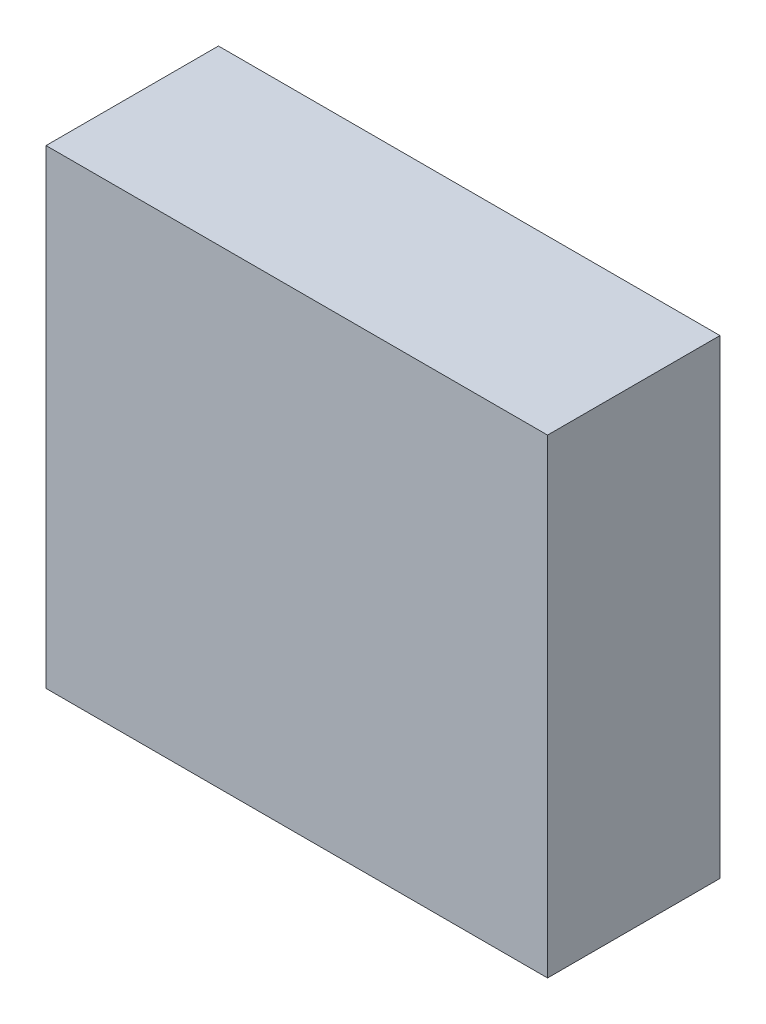
ISO-10303-21;
HEADER;
FILE_DESCRIPTION(('STEP AP214'),'2;1');
FILE_NAME('part.step','',(''),(''),'','','');
FILE_SCHEMA(('AUTOMOTIVE_DESIGN { 1 0 10303 214 1 1 1 1 }'));
ENDSEC;
DATA;
#1=APPLICATION_CONTEXT('core data for automotive mechanical design processes');
#2=APPLICATION_PROTOCOL_DEFINITION('international standard','automotive_design',2000,#1);
#3=PRODUCT_CONTEXT('',#1,'mechanical');
#4=PRODUCT('Part','Part','',(#3));
#5=PRODUCT_RELATED_PRODUCT_CATEGORY('part','',(#4));
#6=PRODUCT_DEFINITION_FORMATION('','',#4);
#7=PRODUCT_DEFINITION_CONTEXT('part definition',#1,'design');
#8=PRODUCT_DEFINITION('design','',#6,#7);
#9=PRODUCT_DEFINITION_SHAPE('','',#8);
#10=(LENGTH_UNIT() NAMED_UNIT(*) SI_UNIT(.MILLI.,.METRE.));
#11=(NAMED_UNIT(*) PLANE_ANGLE_UNIT() SI_UNIT($,.RADIAN.));
#12=(NAMED_UNIT(*) SI_UNIT($,.STERADIAN.) SOLID_ANGLE_UNIT());
#13=UNCERTAINTY_MEASURE_WITH_UNIT(LENGTH_MEASURE(1.E-05),#10,'distance_accuracy_value','');
#14=(GEOMETRIC_REPRESENTATION_CONTEXT(3) GLOBAL_UNCERTAINTY_ASSIGNED_CONTEXT((#13)) GLOBAL_UNIT_ASSIGNED_CONTEXT((#10,
#11,#12)) REPRESENTATION_CONTEXT('',''));
#15=CARTESIAN_POINT('',(0.,0.,0.));
#16=DIRECTION('',(0.,0.,1.));
#17=DIRECTION('',(1.,0.,0.));
#18=AXIS2_PLACEMENT_3D('',#15,#16,#17);
#19=CARTESIAN_POINT('',(42.,-174.,242.5));
#20=DIRECTION('',(0.,0.,1.));
#21=DIRECTION('',(1.,0.,0.));
#22=AXIS2_PLACEMENT_3D('',#19,#20,#21);
#23=PLANE('',#22);
#24=DIRECTION('',(0.,1.,0.));
#25=VECTOR('',#24,1.);
#26=CARTESIAN_POINT('',(42.,-174.,242.5));
#27=LINE('',#26,#25);
#28=CARTESIAN_POINT('',(42.,-174.,242.5));
#29=VERTEX_POINT('',#28);
#30=CARTESIAN_POINT('',(42.,-114.,242.5));
#31=VERTEX_POINT('',#30);
#32=EDGE_CURVE('E18',#29,#31,#27,.T.);
#33=ORIENTED_EDGE('',*,*,#32,.F.);
#34=DIRECTION('',(1.,0.,0.));
#35=VECTOR('',#34,1.);
#36=CARTESIAN_POINT('',(42.,-174.,242.5));
#37=LINE('',#36,#35);
#38=CARTESIAN_POINT('',(106.,-174.,242.5));
#39=VERTEX_POINT('',#38);
#40=EDGE_CURVE('E148',#29,#39,#37,.T.);
#41=ORIENTED_EDGE('',*,*,#40,.T.);
#42=DIRECTION('',(0.,1.,0.));
#43=VECTOR('',#42,1.);
#44=CARTESIAN_POINT('',(106.,-174.,242.5));
#45=LINE('',#44,#43);
#46=CARTESIAN_POINT('',(106.,-114.,242.5));
#47=VERTEX_POINT('',#46);
#48=EDGE_CURVE('E67',#39,#47,#45,.T.);
#49=ORIENTED_EDGE('',*,*,#48,.T.);
#50=DIRECTION('',(1.,0.,0.));
#51=VECTOR('',#50,1.);
#52=CARTESIAN_POINT('',(42.,-114.,242.5));
#53=LINE('',#52,#51);
#54=EDGE_CURVE('E9',#31,#47,#53,.T.);
#55=ORIENTED_EDGE('',*,*,#54,.F.);
#56=EDGE_LOOP('',(#33,#41,#49,#55));
#57=FACE_BOUND('',#56,.T.);
#58=ADVANCED_FACE('F14',(#57),#23,.T.);
#59=CARTESIAN_POINT('',(42.,-174.,220.5));
#60=DIRECTION('',(0.,0.,1.));
#61=DIRECTION('',(1.,0.,0.));
#62=AXIS2_PLACEMENT_3D('',#59,#60,#61);
#63=PLANE('',#62);
#64=DIRECTION('',(1.,0.,0.));
#65=VECTOR('',#64,1.);
#66=CARTESIAN_POINT('',(42.,-114.,220.5));
#67=LINE('',#66,#65);
#68=CARTESIAN_POINT('',(42.,-114.,220.5));
#69=VERTEX_POINT('',#68);
#70=CARTESIAN_POINT('',(106.,-114.,220.5));
#71=VERTEX_POINT('',#70);
#72=EDGE_CURVE('E25',#69,#71,#67,.T.);
#73=ORIENTED_EDGE('',*,*,#72,.T.);
#74=DIRECTION('',(0.,1.,0.));
#75=VECTOR('',#74,1.);
#76=CARTESIAN_POINT('',(106.,-174.,220.5));
#77=LINE('',#76,#75);
#78=CARTESIAN_POINT('',(106.,-174.,220.5));
#79=VERTEX_POINT('',#78);
#80=EDGE_CURVE('E160',#79,#71,#77,.T.);
#81=ORIENTED_EDGE('',*,*,#80,.F.);
#82=DIRECTION('',(1.,0.,0.));
#83=VECTOR('',#82,1.);
#84=CARTESIAN_POINT('',(42.,-174.,220.5));
#85=LINE('',#84,#83);
#86=CARTESIAN_POINT('',(42.,-174.,220.5));
#87=VERTEX_POINT('',#86);
#88=EDGE_CURVE('E151',#87,#79,#85,.T.);
#89=ORIENTED_EDGE('',*,*,#88,.F.);
#90=DIRECTION('',(0.,1.,0.));
#91=VECTOR('',#90,1.);
#92=CARTESIAN_POINT('',(42.,-174.,220.5));
#93=LINE('',#92,#91);
#94=EDGE_CURVE('E75',#87,#69,#93,.T.);
#95=ORIENTED_EDGE('',*,*,#94,.T.);
#96=EDGE_LOOP('',(#73,#81,#89,#95));
#97=FACE_BOUND('',#96,.T.);
#98=ADVANCED_FACE('F87',(#97),#63,.F.);
#99=CARTESIAN_POINT('',(42.,-114.,220.5));
#100=DIRECTION('',(0.,1.,0.));
#101=DIRECTION('',(1.,0.,0.));
#102=AXIS2_PLACEMENT_3D('',#99,#100,#101);
#103=PLANE('',#102);
#104=ORIENTED_EDGE('',*,*,#72,.F.);
#105=DIRECTION('',(0.,0.,1.));
#106=VECTOR('',#105,1.);
#107=CARTESIAN_POINT('',(42.,-114.,220.5));
#108=LINE('',#107,#106);
#109=EDGE_CURVE('E70',#69,#31,#108,.T.);
#110=ORIENTED_EDGE('',*,*,#109,.T.);
#111=ORIENTED_EDGE('',*,*,#54,.T.);
#112=DIRECTION('',(0.,0.,1.));
#113=VECTOR('',#112,1.);
#114=CARTESIAN_POINT('',(106.,-114.,220.5));
#115=LINE('',#114,#113);
#116=EDGE_CURVE('E156',#71,#47,#115,.T.);
#117=ORIENTED_EDGE('',*,*,#116,.F.);
#118=EDGE_LOOP('',(#104,#110,#111,#117));
#119=FACE_BOUND('',#118,.T.);
#120=ADVANCED_FACE('F71',(#119),#103,.T.);
#121=CARTESIAN_POINT('',(42.,-174.,220.5));
#122=DIRECTION('',(0.,1.,0.));
#123=DIRECTION('',(1.,0.,0.));
#124=AXIS2_PLACEMENT_3D('',#121,#122,#123);
#125=PLANE('',#124);
#126=DIRECTION('',(0.,0.,1.));
#127=VECTOR('',#126,1.);
#128=CARTESIAN_POINT('',(106.,-174.,220.5));
#129=LINE('',#128,#127);
#130=EDGE_CURVE('E155',#79,#39,#129,.T.);
#131=ORIENTED_EDGE('',*,*,#130,.T.);
#132=ORIENTED_EDGE('',*,*,#40,.F.);
#133=DIRECTION('',(0.,0.,1.));
#134=VECTOR('',#133,1.);
#135=CARTESIAN_POINT('',(42.,-174.,220.5));
#136=LINE('',#135,#134);
#137=EDGE_CURVE('E79',#87,#29,#136,.T.);
#138=ORIENTED_EDGE('',*,*,#137,.F.);
#139=ORIENTED_EDGE('',*,*,#88,.T.);
#140=EDGE_LOOP('',(#131,#132,#138,#139));
#141=FACE_BOUND('',#140,.T.);
#142=ADVANCED_FACE('F16',(#141),#125,.F.);
#143=CARTESIAN_POINT('',(106.,-174.,220.5));
#144=DIRECTION('',(1.,0.,0.));
#145=DIRECTION('',(0.,1.,0.));
#146=AXIS2_PLACEMENT_3D('',#143,#144,#145);
#147=PLANE('',#146);
#148=ORIENTED_EDGE('',*,*,#130,.F.);
#149=ORIENTED_EDGE('',*,*,#80,.T.);
#150=ORIENTED_EDGE('',*,*,#116,.T.);
#151=ORIENTED_EDGE('',*,*,#48,.F.);
#152=EDGE_LOOP('',(#148,#149,#150,#151));
#153=FACE_BOUND('',#152,.T.);
#154=ADVANCED_FACE('F107',(#153),#147,.T.);
#155=CARTESIAN_POINT('',(42.,-174.,220.5));
#156=DIRECTION('',(1.,0.,0.));
#157=DIRECTION('',(0.,1.,0.));
#158=AXIS2_PLACEMENT_3D('',#155,#156,#157);
#159=PLANE('',#158);
#160=ORIENTED_EDGE('',*,*,#32,.T.);
#161=ORIENTED_EDGE('',*,*,#109,.F.);
#162=ORIENTED_EDGE('',*,*,#94,.F.);
#163=ORIENTED_EDGE('',*,*,#137,.T.);
#164=EDGE_LOOP('',(#160,#161,#162,#163));
#165=FACE_BOUND('',#164,.T.);
#166=ADVANCED_FACE('F77',(#165),#159,.F.);
#167=CLOSED_SHELL('',(#58,#98,#120,#142,#154,#166));
#168=MANIFOLD_SOLID_BREP('B1',#167);
#169=ADVANCED_BREP_SHAPE_REPRESENTATION('',(#18,#168),#14);
#170=SHAPE_DEFINITION_REPRESENTATION(#9,#169);
ENDSEC;
END-ISO-10303-21;
